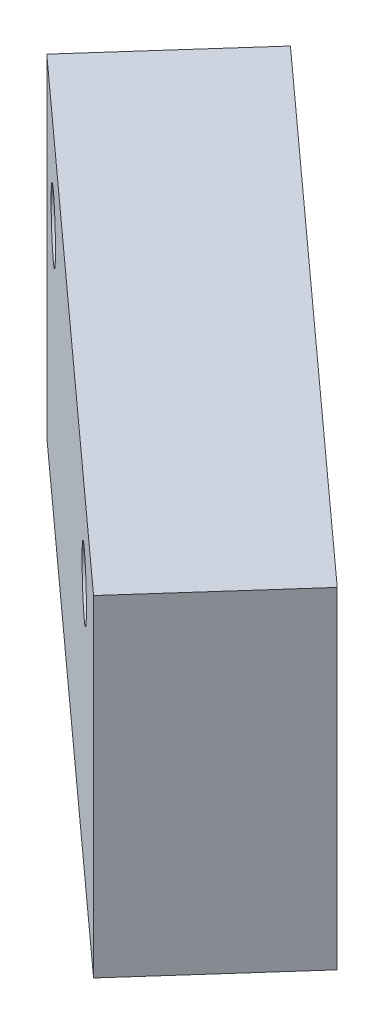
ISO-10303-21;
HEADER;
FILE_DESCRIPTION(('STEP AP214'),'2;1');
FILE_NAME('part.step','',(''),(''),'','','');
FILE_SCHEMA(('AUTOMOTIVE_DESIGN { 1 0 10303 214 1 1 1 1 }'));
ENDSEC;
DATA;
#1=APPLICATION_CONTEXT('core data for automotive mechanical design processes');
#2=APPLICATION_PROTOCOL_DEFINITION('international standard','automotive_design',2000,#1);
#3=PRODUCT_CONTEXT('',#1,'mechanical');
#4=PRODUCT('Part','Part','',(#3));
#5=PRODUCT_RELATED_PRODUCT_CATEGORY('part','',(#4));
#6=PRODUCT_DEFINITION_FORMATION('','',#4);
#7=PRODUCT_DEFINITION_CONTEXT('part definition',#1,'design');
#8=PRODUCT_DEFINITION('design','',#6,#7);
#9=PRODUCT_DEFINITION_SHAPE('','',#8);
#10=(LENGTH_UNIT() NAMED_UNIT(*) SI_UNIT(.MILLI.,.METRE.));
#11=(NAMED_UNIT(*) PLANE_ANGLE_UNIT() SI_UNIT($,.RADIAN.));
#12=(NAMED_UNIT(*) SI_UNIT($,.STERADIAN.) SOLID_ANGLE_UNIT());
#13=UNCERTAINTY_MEASURE_WITH_UNIT(LENGTH_MEASURE(1.E-05),#10,'distance_accuracy_value','');
#14=(GEOMETRIC_REPRESENTATION_CONTEXT(3) GLOBAL_UNCERTAINTY_ASSIGNED_CONTEXT((#13)) GLOBAL_UNIT_ASSIGNED_CONTEXT((#10,
#11,#12)) REPRESENTATION_CONTEXT('',''));
#15=CARTESIAN_POINT('',(0.,0.,0.));
#16=DIRECTION('',(0.,0.,1.));
#17=DIRECTION('',(1.,0.,0.));
#18=AXIS2_PLACEMENT_3D('',#15,#16,#17);
#19=CARTESIAN_POINT('',(0.180321334409129,0.,-0.199266915510276));
#20=DIRECTION('',(0.670979247329059,0.,-0.74147612884956));
#21=DIRECTION('',(-0.74147612884956,0.,-0.670979247329059));
#22=AXIS2_PLACEMENT_3D('',#19,#20,#21);
#23=PLANE('',#22);
#24=DIRECTION('',(0.,-1.,0.));
#25=VECTOR('',#24,1.);
#26=CARTESIAN_POINT('',(-17.7575242155149,27.,-16.4316466746096));
#27=LINE('',#26,#25);
#28=CARTESIAN_POINT('',(-17.7575242155149,27.,-16.4316466746096));
#29=VERTEX_POINT('',#28);
#30=CARTESIAN_POINT('',(-17.7575242155149,0.,-16.4316466746096));
#31=VERTEX_POINT('',#30);
#32=EDGE_CURVE('E289',#29,#31,#27,.T.);
#33=ORIENTED_EDGE('',*,*,#32,.F.);
#34=DIRECTION('',(0.74147612884956,0.,0.670979247329059));
#35=VECTOR('',#34,1.);
#36=CARTESIAN_POINT('',(0.180321334409129,27.,-0.199266915510276));
#37=LINE('',#36,#35);
#38=CARTESIAN_POINT('',(22.3728310041526,27.,19.8832588127975));
#39=VERTEX_POINT('',#38);
#40=EDGE_CURVE('E298',#29,#39,#37,.T.);
#41=ORIENTED_EDGE('',*,*,#40,.T.);
#42=DIRECTION('',(0.,1.,0.));
#43=VECTOR('',#42,1.);
#44=CARTESIAN_POINT('',(22.3728310041526,27.,19.8832588127975));
#45=LINE('',#44,#43);
#46=CARTESIAN_POINT('',(22.3728310041526,0.,19.8832588127975));
#47=VERTEX_POINT('',#46);
#48=EDGE_CURVE('E293',#47,#39,#45,.T.);
#49=ORIENTED_EDGE('',*,*,#48,.F.);
#50=DIRECTION('',(0.74147612884956,0.,0.670979247329059));
#51=VECTOR('',#50,1.);
#52=CARTESIAN_POINT('',(0.180321334409129,0.,-0.199266915510276));
#53=LINE('',#52,#51);
#54=CARTESIAN_POINT('',(19.241101723208,0.,17.0492830797865));
#55=VERTEX_POINT('',#54);
#56=EDGE_CURVE('E282',#55,#47,#53,.T.);
#57=ORIENTED_EDGE('',*,*,#56,.F.);
#58=DIRECTION('',(0.,-1.,0.));
#59=VECTOR('',#58,1.);
#60=CARTESIAN_POINT('',(19.241101723208,7.,17.0492830797865));
#61=LINE('',#60,#59);
#62=CARTESIAN_POINT('',(19.241101723208,7.,17.0492830797865));
#63=VERTEX_POINT('',#62);
#64=EDGE_CURVE('E313',#63,#55,#61,.T.);
#65=ORIENTED_EDGE('',*,*,#64,.F.);
#66=DIRECTION('',(-0.74147612884956,0.,-0.670979247329059));
#67=VECTOR('',#66,1.);
#68=CARTESIAN_POINT('',(0.180321334409129,7.,-0.199266915510276));
#69=LINE('',#68,#67);
#70=CARTESIAN_POINT('',(16.3901305800542,7.,14.4693720113638));
#71=VERTEX_POINT('',#70);
#72=EDGE_CURVE('E309',#63,#71,#69,.T.);
#73=ORIENTED_EDGE('',*,*,#72,.T.);
#74=DIRECTION('',(0.,-1.,0.));
#75=VECTOR('',#74,1.);
#76=CARTESIAN_POINT('',(16.3901305800542,7.,14.4693720113638));
#77=LINE('',#76,#75);
#78=CARTESIAN_POINT('',(16.3901305800542,0.,14.4693720113638));
#79=VERTEX_POINT('',#78);
#80=EDGE_CURVE('E330',#71,#79,#77,.T.);
#81=ORIENTED_EDGE('',*,*,#80,.T.);
#82=DIRECTION('',(0.74147612884956,0.,0.670979247329059));
#83=VECTOR('',#82,1.);
#84=CARTESIAN_POINT('',(0.180321334409129,0.,-0.199266915510276));
#85=LINE('',#84,#83);
#86=CARTESIAN_POINT('',(13.5040535540342,0.,11.8576928010605));
#87=VERTEX_POINT('',#86);
#88=EDGE_CURVE('E270',#87,#79,#85,.T.);
#89=ORIENTED_EDGE('',*,*,#88,.F.);
#90=DIRECTION('',(0.,-1.,0.));
#91=VECTOR('',#90,1.);
#92=CARTESIAN_POINT('',(13.5040535540342,7.,11.8576928010605));
#93=LINE('',#92,#91);
#94=CARTESIAN_POINT('',(13.5040535540342,7.,11.8576928010605));
#95=VERTEX_POINT('',#94);
#96=EDGE_CURVE('E326',#87,#95,#93,.F.);
#97=ORIENTED_EDGE('',*,*,#96,.T.);
#98=CARTESIAN_POINT('',(10.1268477535171,7.,8.80157957240913));
#99=VERTEX_POINT('',#98);
#100=EDGE_CURVE('E260',#95,#99,#69,.T.);
#101=ORIENTED_EDGE('',*,*,#100,.T.);
#102=DIRECTION('',(0.,-1.,0.));
#103=VECTOR('',#102,1.);
#104=CARTESIAN_POINT('',(10.1268477535171,22.,8.80157957240913));
#105=LINE('',#104,#103);
#106=CARTESIAN_POINT('',(10.1268477535171,22.,8.80157957240914));
#107=VERTEX_POINT('',#106);
#108=EDGE_CURVE('E317',#107,#99,#105,.T.);
#109=ORIENTED_EDGE('',*,*,#108,.F.);
#110=DIRECTION('',(-0.74147612884956,0.,-0.670979247329059));
#111=VECTOR('',#110,1.);
#112=CARTESIAN_POINT('',(0.180321334409129,22.,-0.199266915510276));
#113=LINE('',#112,#111);
#114=CARTESIAN_POINT('',(6.10878243947018,22.,5.16553744611543));
#115=VERTEX_POINT('',#114);
#116=EDGE_CURVE('E351',#107,#115,#113,.T.);
#117=ORIENTED_EDGE('',*,*,#116,.T.);
#118=DIRECTION('',(0.,1.,0.));
#119=VECTOR('',#118,1.);
#120=CARTESIAN_POINT('',(6.10878243947018,12.,5.16553744611543));
#121=LINE('',#120,#119);
#122=CARTESIAN_POINT('',(6.10878243947018,12.,5.16553744611543));
#123=VERTEX_POINT('',#122);
#124=EDGE_CURVE('E347',#123,#115,#121,.T.);
#125=ORIENTED_EDGE('',*,*,#124,.F.);
#126=DIRECTION('',(-0.74147612884956,0.,-0.670979247329059));
#127=VECTOR('',#126,1.);
#128=CARTESIAN_POINT('',(0.180321334409129,12.,-0.199266915510276));
#129=LINE('',#128,#127);
#130=CARTESIAN_POINT('',(5.2950846684095,12.,4.42920313036783));
#131=VERTEX_POINT('',#130);
#132=EDGE_CURVE('E352',#123,#131,#129,.T.);
#133=ORIENTED_EDGE('',*,*,#132,.T.);
#134=DIRECTION('',(0.,-1.,0.));
#135=VECTOR('',#134,1.);
#136=CARTESIAN_POINT('',(5.2950846684095,7.,4.42920313036783));
#137=LINE('',#136,#135);
#138=CARTESIAN_POINT('',(5.2950846684095,0.,4.42920313036783));
#139=VERTEX_POINT('',#138);
#140=EDGE_CURVE('E261',#131,#139,#137,.T.);
#141=ORIENTED_EDGE('',*,*,#140,.T.);
#142=DIRECTION('',(0.74147612884956,0.,0.670979247329059));
#143=VECTOR('',#142,1.);
#144=CARTESIAN_POINT('',(0.180321334409129,0.,-0.199266915510276));
#145=LINE('',#144,#143);
#146=CARTESIAN_POINT('',(-4.63515238000912,0.,-4.55690272159674));
#147=VERTEX_POINT('',#146);
#148=EDGE_CURVE('E45',#147,#139,#145,.T.);
#149=ORIENTED_EDGE('',*,*,#148,.F.);
#150=DIRECTION('',(0.,-1.,0.));
#151=VECTOR('',#150,1.);
#152=CARTESIAN_POINT('',(-4.63515238000912,7.,-4.55690272159674));
#153=LINE('',#152,#151);
#154=CARTESIAN_POINT('',(-4.63515238000912,12.,-4.55690272159674));
#155=VERTEX_POINT('',#154);
#156=EDGE_CURVE('E253',#147,#155,#153,.F.);
#157=ORIENTED_EDGE('',*,*,#156,.T.);
#158=DIRECTION('',(-0.74147612884956,0.,-0.670979247329059));
#159=VECTOR('',#158,1.);
#160=CARTESIAN_POINT('',(0.180321334409129,12.,-0.199266915510276));
#161=LINE('',#160,#159);
#162=CARTESIAN_POINT('',(-5.74813977065192,12.,-5.56407127713598));
#163=VERTEX_POINT('',#162);
#164=EDGE_CURVE('E355',#155,#163,#161,.T.);
#165=ORIENTED_EDGE('',*,*,#164,.T.);
#166=DIRECTION('',(0.,1.,0.));
#167=VECTOR('',#166,1.);
#168=CARTESIAN_POINT('',(-5.74813977065192,12.,-5.56407127713598));
#169=LINE('',#168,#167);
#170=CARTESIAN_POINT('',(-5.74813977065192,22.,-5.56407127713598));
#171=VERTEX_POINT('',#170);
#172=EDGE_CURVE('E358',#171,#163,#169,.F.);
#173=ORIENTED_EDGE('',*,*,#172,.F.);
#174=CARTESIAN_POINT('',(-6.45742945742896,22.,-6.20592425345544));
#175=VERTEX_POINT('',#174);
#176=EDGE_CURVE('E343',#171,#175,#113,.T.);
#177=ORIENTED_EDGE('',*,*,#176,.T.);
#178=DIRECTION('',(0.,-1.,0.));
#179=VECTOR('',#178,1.);
#180=CARTESIAN_POINT('',(-6.45742945742896,22.,-6.20592425345544));
#181=LINE('',#180,#179);
#182=CARTESIAN_POINT('',(-6.45742945742896,7.,-6.20592425345544));
#183=VERTEX_POINT('',#182);
#184=EDGE_CURVE('E339',#175,#183,#181,.T.);
#185=ORIENTED_EDGE('',*,*,#184,.T.);
#186=DIRECTION('',(-0.74147612884956,0.,-0.670979247329059));
#187=VECTOR('',#186,1.);
#188=CARTESIAN_POINT('',(0.180321334409129,7.,-0.199266915510276));
#189=LINE('',#188,#187);
#190=CARTESIAN_POINT('',(-8.11647189445451,7.,-7.7072309069947));
#191=VERTEX_POINT('',#190);
#192=EDGE_CURVE('E338',#183,#191,#189,.T.);
#193=ORIENTED_EDGE('',*,*,#192,.T.);
#194=DIRECTION('',(0.,-1.,0.));
#195=VECTOR('',#194,1.);
#196=CARTESIAN_POINT('',(-8.11647189445451,7.,-7.7072309069947));
#197=LINE('',#196,#195);
#198=CARTESIAN_POINT('',(-8.11647189445451,0.,-7.7072309069947));
#199=VERTEX_POINT('',#198);
#200=EDGE_CURVE('E322',#191,#199,#197,.T.);
#201=ORIENTED_EDGE('',*,*,#200,.T.);
#202=DIRECTION('',(0.74147612884956,0.,0.670979247329059));
#203=VECTOR('',#202,1.);
#204=CARTESIAN_POINT('',(0.180321334409129,0.,-0.199266915510276));
#205=LINE('',#204,#203);
#206=CARTESIAN_POINT('',(-11.0968622551529,0.,-10.4042564795792));
#207=VERTEX_POINT('',#206);
#208=EDGE_CURVE('E277',#207,#199,#205,.T.);
#209=ORIENTED_EDGE('',*,*,#208,.F.);
#210=DIRECTION('',(0.,-1.,0.));
#211=VECTOR('',#210,1.);
#212=CARTESIAN_POINT('',(-11.0968622551529,7.,-10.4042564795792));
#213=LINE('',#212,#211);
#214=CARTESIAN_POINT('',(-11.0968622551529,7.,-10.4042564795792));
#215=VERTEX_POINT('',#214);
#216=EDGE_CURVE('E318',#207,#215,#213,.F.);
#217=ORIENTED_EDGE('',*,*,#216,.T.);
#218=CARTESIAN_POINT('',(-13.9430557088245,7.,-12.9798441040392));
#219=VERTEX_POINT('',#218);
#220=EDGE_CURVE('E334',#215,#219,#189,.T.);
#221=ORIENTED_EDGE('',*,*,#220,.T.);
#222=DIRECTION('',(0.,-1.,0.));
#223=VECTOR('',#222,1.);
#224=CARTESIAN_POINT('',(-13.9430557088245,7.,-12.9798441040392));
#225=LINE('',#224,#223);
#226=CARTESIAN_POINT('',(-13.9430557088245,0.,-12.9798441040392));
#227=VERTEX_POINT('',#226);
#228=EDGE_CURVE('E297',#227,#219,#225,.F.);
#229=ORIENTED_EDGE('',*,*,#228,.F.);
#230=EDGE_CURVE('E285',#31,#227,#53,.T.);
#231=ORIENTED_EDGE('',*,*,#230,.F.);
#232=EDGE_LOOP('',(#33,#41,#49,#57,#65,#73,#81,#89,#97,#101,#109,#117,#125,#133,#141,#149,#157,
#165,#173,#177,#185,#193,#201,#209,#217,#221,#229,#231));
#233=FACE_BOUND('',#232,.T.);
#234=CARTESIAN_POINT('',(-12.0858954641083,20.2282122973391,-11.299255970875));
#235=DIRECTION('',(0.670979247329059,0.,-0.74147612884956));
#236=DIRECTION('',(-0.74147612884956,0.,-0.670979247329059));
#237=AXIS2_PLACEMENT_3D('',#234,#235,#236);
#238=CIRCLE('',#237,2.5);
#239=CARTESIAN_POINT('',(-13.9395857862322,20.2282122973391,-12.9767040891976));
#240=VERTEX_POINT('',#239);
#241=EDGE_CURVE('E302',#240,#240,#238,.F.);
#242=ORIENTED_EDGE('',*,*,#241,.T.);
#243=EDGE_LOOP('',(#242));
#244=FACE_BOUND('',#243,.T.);
#245=CARTESIAN_POINT('',(14.4574317839117,20.2282122973391,12.7204272603554));
#246=DIRECTION('',(0.670979247329059,0.,-0.74147612884956));
#247=DIRECTION('',(-0.74147612884956,0.,-0.670979247329059));
#248=AXIS2_PLACEMENT_3D('',#245,#246,#247);
#249=CIRCLE('',#248,2.5);
#250=CARTESIAN_POINT('',(12.6037414617879,20.2282122973391,11.0429791420328));
#251=VERTEX_POINT('',#250);
#252=EDGE_CURVE('E304',#251,#251,#249,.F.);
#253=ORIENTED_EDGE('',*,*,#252,.T.);
#254=EDGE_LOOP('',(#253));
#255=FACE_BOUND('',#254,.T.);
#256=ADVANCED_FACE('F42',(#233,#244,#255),#23,.T.);
#257=CARTESIAN_POINT('',(-2.25,12.,0.));
#258=DIRECTION('',(0.,1.,0.));
#259=DIRECTION('',(0.,0.,1.));
#260=AXIS2_PLACEMENT_3D('',#257,#258,#259);
#261=PLANE('',#260);
#262=CARTESIAN_POINT('',(-4.5,12.,0.));
#263=DIRECTION('',(0.,1.,0.));
#264=DIRECTION('',(0.,0.,1.));
#265=AXIS2_PLACEMENT_3D('',#262,#263,#264);
#266=CIRCLE('',#265,4.5);
#267=CARTESIAN_POINT('',(-7.11111111111111,12.,-3.66498277832681));
#268=VERTEX_POINT('',#267);
#269=CARTESIAN_POINT('',(-7.11111111111111,12.,3.66498277832681));
#270=VERTEX_POINT('',#269);
#271=EDGE_CURVE('E269',#268,#270,#266,.T.);
#272=ORIENTED_EDGE('',*,*,#271,.T.);
#273=CARTESIAN_POINT('',(0.,12.,0.));
#274=DIRECTION('',(0.,-1.,0.));
#275=DIRECTION('',(0.,0.,1.));
#276=AXIS2_PLACEMENT_3D('',#273,#274,#275);
#277=CIRCLE('',#276,8.);
#278=EDGE_CURVE('E274',#270,#268,#277,.T.);
#279=ORIENTED_EDGE('',*,*,#278,.T.);
#280=EDGE_LOOP('',(#272,#279));
#281=FACE_BOUND('',#280,.T.);
#282=ADVANCED_FACE('F627',(#281),#261,.T.);
#283=CARTESIAN_POINT('',(0.,12.,0.));
#284=DIRECTION('',(0.,1.,0.));
#285=DIRECTION('',(0.,0.,1.));
#286=AXIS2_PLACEMENT_3D('',#283,#284,#285);
#287=CYLINDRICAL_SURFACE('',#286,8.);
#288=CARTESIAN_POINT('',(0.,22.,0.));
#289=DIRECTION('',(0.,1.,0.));
#290=DIRECTION('',(0.,0.,1.));
#291=AXIS2_PLACEMENT_3D('',#288,#289,#290);
#292=CIRCLE('',#291,8.);
#293=EDGE_CURVE('E396',#171,#115,#292,.T.);
#294=ORIENTED_EDGE('',*,*,#293,.F.);
#295=ORIENTED_EDGE('',*,*,#172,.T.);
#296=CARTESIAN_POINT('',(0.,12.,0.));
#297=DIRECTION('',(0.,1.,0.));
#298=DIRECTION('',(0.,0.,1.));
#299=AXIS2_PLACEMENT_3D('',#296,#297,#298);
#300=CIRCLE('',#299,8.);
#301=EDGE_CURVE('E443',#163,#268,#300,.T.);
#302=ORIENTED_EDGE('',*,*,#301,.T.);
#303=ORIENTED_EDGE('',*,*,#278,.F.);
#304=EDGE_CURVE('E440',#270,#123,#300,.T.);
#305=ORIENTED_EDGE('',*,*,#304,.T.);
#306=ORIENTED_EDGE('',*,*,#124,.T.);
#307=EDGE_LOOP('',(#294,#295,#302,#303,#305,#306));
#308=FACE_BOUND('',#307,.T.);
#309=ADVANCED_FACE('F629',(#308),#287,.T.);
#310=CARTESIAN_POINT('',(0.,22.,0.));
#311=DIRECTION('',(0.,1.,0.));
#312=DIRECTION('',(0.,0.,1.));
#313=AXIS2_PLACEMENT_3D('',#310,#311,#312);
#314=PLANE('',#313);
#315=ORIENTED_EDGE('',*,*,#116,.F.);
#316=CARTESIAN_POINT('',(2.81741341811794,22.,1.18386679753758));
#317=DIRECTION('',(0.,1.,0.));
#318=DIRECTION('',(0.,0.,1.));
#319=AXIS2_PLACEMENT_3D('',#316,#317,#318);
#320=CIRCLE('',#319,10.5573376484771);
#321=CARTESIAN_POINT('',(-1.4542464793394,22.,10.8384149456597));
#322=VERTEX_POINT('',#321);
#323=EDGE_CURVE('E417',#322,#107,#320,.T.);
#324=ORIENTED_EDGE('',*,*,#323,.F.);
#325=DIRECTION('',(0.914487010796204,0.,0.40461525809715));
#326=VECTOR('',#325,1.);
#327=CARTESIAN_POINT('',(-4.24846021002008,22.,9.60211361336014));
#328=LINE('',#327,#326);
#329=CARTESIAN_POINT('',(-4.24846021002008,22.,9.60211361336014));
#330=VERTEX_POINT('',#329);
#331=EDGE_CURVE('E421',#330,#322,#328,.T.);
#332=ORIENTED_EDGE('',*,*,#331,.F.);
#333=CARTESIAN_POINT('',(0.,22.,0.));
#334=DIRECTION('',(0.,1.,0.));
#335=DIRECTION('',(0.,0.,1.));
#336=AXIS2_PLACEMENT_3D('',#333,#334,#335);
#337=CIRCLE('',#336,10.5);
#338=CARTESIAN_POINT('',(-4.85530679933666,22.,9.30999440839334));
#339=VERTEX_POINT('',#338);
#340=EDGE_CURVE('E480',#339,#330,#337,.T.);
#341=ORIENTED_EDGE('',*,*,#340,.F.);
#342=CARTESIAN_POINT('',(-46.4722222222223,22.,89.1099464803362));
#343=DIRECTION('',(0.,1.,0.));
#344=DIRECTION('',(0.,0.,1.));
#345=AXIS2_PLACEMENT_3D('',#342,#343,#344);
#346=CIRCLE('',#345,90.);
#347=CARTESIAN_POINT('',(-8.12196841511563,22.,7.68969081302393));
#348=VERTEX_POINT('',#347);
#349=EDGE_CURVE('E477',#348,#339,#346,.F.);
#350=ORIENTED_EDGE('',*,*,#349,.F.);
#351=CARTESIAN_POINT('',(-4.5,22.,0.));
#352=DIRECTION('',(0.,1.,0.));
#353=DIRECTION('',(0.,0.,1.));
#354=AXIS2_PLACEMENT_3D('',#351,#352,#353);
#355=CIRCLE('',#354,8.5);
#356=CARTESIAN_POINT('',(-12.3085207840849,22.,3.35812494772206));
#357=VERTEX_POINT('',#356);
#358=EDGE_CURVE('E473',#357,#348,#355,.T.);
#359=ORIENTED_EDGE('',*,*,#358,.F.);
#360=DIRECTION('',(0.252032006088508,0.,0.967718899219707));
#361=VECTOR('',#360,1.);
#362=CARTESIAN_POINT('',(-12.3457156152864,22.,3.21530919322515));
#363=LINE('',#362,#361);
#364=CARTESIAN_POINT('',(-13.4468800977769,22.,-1.01279539314789));
#365=VERTEX_POINT('',#364);
#366=EDGE_CURVE('E470',#365,#357,#363,.T.);
#367=ORIENTED_EDGE('',*,*,#366,.F.);
#368=CARTESIAN_POINT('',(-11.5114422993375,22.,-1.51685940532491));
#369=DIRECTION('',(0.,1.,0.));
#370=DIRECTION('',(0.,0.,1.));
#371=AXIS2_PLACEMENT_3D('',#368,#369,#370);
#372=CIRCLE('',#371,2.);
#373=CARTESIAN_POINT('',(-11.2323330034858,22.,-3.49728814702938));
#374=VERTEX_POINT('',#373);
#375=EDGE_CURVE('E425',#365,#374,#372,.F.);
#376=ORIENTED_EDGE('',*,*,#375,.T.);
#377=CARTESIAN_POINT('',(-10.6043370878193,22.,-7.95325281586443));
#378=DIRECTION('',(0.,1.,0.));
#379=DIRECTION('',(0.,0.,1.));
#380=AXIS2_PLACEMENT_3D('',#377,#378,#379);
#381=CIRCLE('',#380,4.5);
#382=EDGE_CURVE('E422',#374,#175,#381,.T.);
#383=ORIENTED_EDGE('',*,*,#382,.T.);
#384=ORIENTED_EDGE('',*,*,#176,.F.);
#385=ORIENTED_EDGE('',*,*,#293,.T.);
#386=EDGE_LOOP('',(#315,#324,#332,#341,#350,#359,#367,#376,#383,#384,#385));
#387=FACE_BOUND('',#386,.T.);
#388=ADVANCED_FACE('F580',(#387),#314,.F.);
#389=CARTESIAN_POINT('',(-12.3457156152864,22.,3.21530919322515));
#390=DIRECTION('',(0.967718899219707,0.,-0.252032006088508));
#391=DIRECTION('',(-0.252032006088508,0.,-0.967718899219707));
#392=AXIS2_PLACEMENT_3D('',#389,#390,#391);
#393=PLANE('',#392);
#394=DIRECTION('',(0.252032006088508,0.,0.967718899219707));
#395=VECTOR('',#394,1.);
#396=CARTESIAN_POINT('',(-12.3457156152864,7.,3.21530919322515));
#397=LINE('',#396,#395);
#398=CARTESIAN_POINT('',(-13.4468800977769,7.,-1.01279539314789));
#399=VERTEX_POINT('',#398);
#400=CARTESIAN_POINT('',(-12.3085207840849,7.,3.35812494772206));
#401=VERTEX_POINT('',#400);
#402=EDGE_CURVE('E429',#399,#401,#397,.T.);
#403=ORIENTED_EDGE('',*,*,#402,.F.);
#404=DIRECTION('',(0.,-1.,0.));
#405=VECTOR('',#404,1.);
#406=CARTESIAN_POINT('',(-13.4468800977769,22.,-1.01279539314789));
#407=LINE('',#406,#405);
#408=EDGE_CURVE('E498',#365,#399,#407,.T.);
#409=ORIENTED_EDGE('',*,*,#408,.F.);
#410=ORIENTED_EDGE('',*,*,#366,.T.);
#411=DIRECTION('',(0.,-1.,0.));
#412=VECTOR('',#411,1.);
#413=CARTESIAN_POINT('',(-12.3085207840849,22.,3.35812494772206));
#414=LINE('',#413,#412);
#415=EDGE_CURVE('E494',#357,#401,#414,.T.);
#416=ORIENTED_EDGE('',*,*,#415,.T.);
#417=EDGE_LOOP('',(#403,#409,#410,#416));
#418=FACE_BOUND('',#417,.T.);
#419=ADVANCED_FACE('F639',(#418),#393,.T.);
#420=CARTESIAN_POINT('',(-11.5114422993375,22.,-1.51685940532491));
#421=DIRECTION('',(0.,-1.,0.));
#422=DIRECTION('',(0.,0.,-1.));
#423=AXIS2_PLACEMENT_3D('',#420,#421,#422);
#424=CYLINDRICAL_SURFACE('',#423,2.);
#425=CARTESIAN_POINT('',(-11.5114422993375,7.,-1.51685940532491));
#426=DIRECTION('',(0.,1.,0.));
#427=DIRECTION('',(0.,0.,1.));
#428=AXIS2_PLACEMENT_3D('',#425,#426,#427);
#429=CIRCLE('',#428,2.);
#430=CARTESIAN_POINT('',(-11.2323330034858,7.,-3.49728814702938));
#431=VERTEX_POINT('',#430);
#432=EDGE_CURVE('E433',#399,#431,#429,.F.);
#433=ORIENTED_EDGE('',*,*,#432,.T.);
#434=DIRECTION('',(0.,-1.,0.));
#435=VECTOR('',#434,1.);
#436=CARTESIAN_POINT('',(-11.2323330034858,22.,-3.49728814702938));
#437=LINE('',#436,#435);
#438=EDGE_CURVE('E416',#374,#431,#437,.T.);
#439=ORIENTED_EDGE('',*,*,#438,.F.);
#440=ORIENTED_EDGE('',*,*,#375,.F.);
#441=ORIENTED_EDGE('',*,*,#408,.T.);
#442=EDGE_LOOP('',(#433,#439,#440,#441));
#443=FACE_BOUND('',#442,.T.);
#444=ADVANCED_FACE('F653',(#443),#424,.F.);
#445=CARTESIAN_POINT('',(-10.6043370878193,22.,-7.95325281586443));
#446=DIRECTION('',(0.,-1.,0.));
#447=DIRECTION('',(0.,0.,-1.));
#448=AXIS2_PLACEMENT_3D('',#445,#446,#447);
#449=CYLINDRICAL_SURFACE('',#448,4.5);
#450=ORIENTED_EDGE('',*,*,#184,.F.);
#451=ORIENTED_EDGE('',*,*,#382,.F.);
#452=ORIENTED_EDGE('',*,*,#438,.T.);
#453=CARTESIAN_POINT('',(-10.6043370878193,7.,-7.95325281586443));
#454=DIRECTION('',(0.,1.,0.));
#455=DIRECTION('',(0.,0.,1.));
#456=AXIS2_PLACEMENT_3D('',#453,#454,#455);
#457=CIRCLE('',#456,4.5);
#458=EDGE_CURVE('E430',#431,#183,#457,.T.);
#459=ORIENTED_EDGE('',*,*,#458,.T.);
#460=EDGE_LOOP('',(#450,#451,#452,#459));
#461=FACE_BOUND('',#460,.T.);
#462=ADVANCED_FACE('F585',(#461),#449,.T.);
#463=CARTESIAN_POINT('',(0.,7.,0.));
#464=DIRECTION('',(0.,1.,0.));
#465=DIRECTION('',(0.,0.,1.));
#466=AXIS2_PLACEMENT_3D('',#463,#464,#465);
#467=PLANE('',#466);
#468=ORIENTED_EDGE('',*,*,#192,.F.);
#469=ORIENTED_EDGE('',*,*,#458,.F.);
#470=ORIENTED_EDGE('',*,*,#432,.F.);
#471=ORIENTED_EDGE('',*,*,#402,.T.);
#472=DIRECTION('',(0.39507352326142,0.,0.918649504009994));
#473=VECTOR('',#472,1.);
#474=CARTESIAN_POINT('',(-11.6061468845651,7.,4.99132838058419));
#475=LINE('',#474,#473);
#476=CARTESIAN_POINT('',(-16.1478111942284,7.,-5.56923166659305));
#477=VERTEX_POINT('',#476);
#478=EDGE_CURVE('E409',#477,#401,#475,.T.);
#479=ORIENTED_EDGE('',*,*,#478,.F.);
#480=CARTESIAN_POINT('',(-10.6043370878193,7.,-7.95325281586443));
#481=DIRECTION('',(0.,1.,0.));
#482=DIRECTION('',(0.,0.,1.));
#483=AXIS2_PLACEMENT_3D('',#480,#481,#482);
#484=CIRCLE('',#483,6.03437337331733);
#485=EDGE_CURVE('E406',#219,#477,#484,.T.);
#486=ORIENTED_EDGE('',*,*,#485,.F.);
#487=ORIENTED_EDGE('',*,*,#220,.F.);
#488=CARTESIAN_POINT('',(-10.6043370878193,7.,-7.95325281586443));
#489=DIRECTION('',(0.,1.,0.));
#490=DIRECTION('',(0.,0.,1.));
#491=AXIS2_PLACEMENT_3D('',#488,#489,#490);
#492=CIRCLE('',#491,2.5);
#493=EDGE_CURVE('E410',#215,#191,#492,.T.);
#494=ORIENTED_EDGE('',*,*,#493,.T.);
#495=EDGE_LOOP('',(#468,#469,#470,#471,#479,#486,#487,#494));
#496=FACE_BOUND('',#495,.T.);
#497=ADVANCED_FACE('F591',(#496),#467,.F.);
#498=CARTESIAN_POINT('',(16.0000000000001,7.,12.));
#499=DIRECTION('',(0.,-1.,0.));
#500=DIRECTION('',(0.,0.,-1.));
#501=AXIS2_PLACEMENT_3D('',#498,#499,#500);
#502=CYLINDRICAL_SURFACE('',#501,2.5);
#503=ORIENTED_EDGE('',*,*,#80,.F.);
#504=CARTESIAN_POINT('',(16.0000000000001,7.,12.));
#505=DIRECTION('',(0.,1.,0.));
#506=DIRECTION('',(0.,0.,1.));
#507=AXIS2_PLACEMENT_3D('',#504,#505,#506);
#508=CIRCLE('',#507,2.5);
#509=EDGE_CURVE('E413',#95,#71,#508,.T.);
#510=ORIENTED_EDGE('',*,*,#509,.F.);
#511=ORIENTED_EDGE('',*,*,#96,.F.);
#512=CARTESIAN_POINT('',(16.0000000000001,0.,12.));
#513=DIRECTION('',(0.,1.,0.));
#514=DIRECTION('',(0.,0.,1.));
#515=AXIS2_PLACEMENT_3D('',#512,#513,#514);
#516=CIRCLE('',#515,2.5);
#517=EDGE_CURVE('E389',#87,#79,#516,.T.);
#518=ORIENTED_EDGE('',*,*,#517,.T.);
#519=EDGE_LOOP('',(#503,#510,#511,#518));
#520=FACE_BOUND('',#519,.T.);
#521=ADVANCED_FACE('F608',(#520),#502,.T.);
#522=CARTESIAN_POINT('',(0.,0.,0.));
#523=DIRECTION('',(0.,-1.,0.));
#524=DIRECTION('',(0.,0.,-1.));
#525=AXIS2_PLACEMENT_3D('',#522,#523,#524);
#526=PLANE('',#525);
#527=ORIENTED_EDGE('',*,*,#517,.F.);
#528=ORIENTED_EDGE('',*,*,#88,.T.);
#529=EDGE_LOOP('',(#527,#528));
#530=FACE_BOUND('',#529,.T.);
#531=ADVANCED_FACE('F609',(#530),#526,.T.);
#532=CARTESIAN_POINT('',(2.81741341811794,22.,1.18386679753758));
#533=DIRECTION('',(0.,-1.,0.));
#534=DIRECTION('',(0.,0.,-1.));
#535=AXIS2_PLACEMENT_3D('',#532,#533,#534);
#536=CYLINDRICAL_SURFACE('',#535,10.5573376484771);
#537=ORIENTED_EDGE('',*,*,#323,.T.);
#538=ORIENTED_EDGE('',*,*,#108,.T.);
#539=CARTESIAN_POINT('',(2.81741341811794,7.,1.18386679753758));
#540=DIRECTION('',(0.,1.,0.));
#541=DIRECTION('',(0.,0.,1.));
#542=AXIS2_PLACEMENT_3D('',#539,#540,#541);
#543=CIRCLE('',#542,10.5573376484771);
#544=CARTESIAN_POINT('',(-1.4542464793394,7.,10.8384149456597));
#545=VERTEX_POINT('',#544);
#546=EDGE_CURVE('E426',#545,#99,#543,.T.);
#547=ORIENTED_EDGE('',*,*,#546,.F.);
#548=DIRECTION('',(0.,-1.,0.));
#549=VECTOR('',#548,1.);
#550=CARTESIAN_POINT('',(-1.4542464793394,22.,10.8384149456597));
#551=LINE('',#550,#549);
#552=EDGE_CURVE('E420',#322,#545,#551,.T.);
#553=ORIENTED_EDGE('',*,*,#552,.F.);
#554=EDGE_LOOP('',(#537,#538,#547,#553));
#555=FACE_BOUND('',#554,.T.);
#556=ADVANCED_FACE('F611',(#555),#536,.F.);
#557=CARTESIAN_POINT('',(0.,27.,0.));
#558=DIRECTION('',(0.,-1.,0.));
#559=DIRECTION('',(0.,0.,-1.));
#560=AXIS2_PLACEMENT_3D('',#557,#558,#559);
#561=PLANE('',#560);
#562=ORIENTED_EDGE('',*,*,#40,.F.);
#563=DIRECTION('',(0.665087760425188,0.,-0.746765204687931));
#564=VECTOR('',#563,1.);
#565=CARTESIAN_POINT('',(-27.1139959489316,27.,-5.92613455287848));
#566=LINE('',#565,#564);
#567=CARTESIAN_POINT('',(-27.1139959489316,27.,-5.92613455287848));
#568=VERTEX_POINT('',#567);
#569=EDGE_CURVE('E371',#568,#29,#566,.T.);
#570=ORIENTED_EDGE('',*,*,#569,.F.);
#571=DIRECTION('',(-0.74147612884956,0.,-0.670979247329059));
#572=VECTOR('',#571,1.);
#573=CARTESIAN_POINT('',(13.0163592707359,27.,30.3887709345286));
#574=LINE('',#573,#572);
#575=CARTESIAN_POINT('',(13.0163592707359,27.,30.3887709345286));
#576=VERTEX_POINT('',#575);
#577=EDGE_CURVE('E377',#576,#568,#574,.T.);
#578=ORIENTED_EDGE('',*,*,#577,.F.);
#579=DIRECTION('',(-0.665087760425188,0.,0.746765204687931));
#580=VECTOR('',#579,1.);
#581=CARTESIAN_POINT('',(31.7293027375694,27.,9.37774669106641));
#582=LINE('',#581,#580);
#583=EDGE_CURVE('E374',#39,#576,#582,.T.);
#584=ORIENTED_EDGE('',*,*,#583,.F.);
#585=EDGE_LOOP('',(#562,#570,#578,#584));
#586=FACE_BOUND('',#585,.T.);
#587=ADVANCED_FACE('F617',(#586),#561,.F.);
#588=CARTESIAN_POINT('',(13.0163592707359,27.,30.3887709345286));
#589=DIRECTION('',(-0.670979247329059,0.,0.74147612884956));
#590=DIRECTION('',(0.74147612884956,0.,0.670979247329059));
#591=AXIS2_PLACEMENT_3D('',#588,#589,#590);
#592=PLANE('',#591);
#593=CARTESIAN_POINT('',(-21.524952939005,20.2282122973391,-0.868477635576405));
#594=DIRECTION('',(-0.670979247329059,0.,0.74147612884956));
#595=DIRECTION('',(0.74147612884956,0.,0.670979247329059));
#596=AXIS2_PLACEMENT_3D('',#593,#594,#595);
#597=CIRCLE('',#596,2.5);
#598=CARTESIAN_POINT('',(-19.6712626168811,20.2282122973391,0.808970482746242));
#599=VERTEX_POINT('',#598);
#600=EDGE_CURVE('E52',#599,#599,#597,.T.);
#601=ORIENTED_EDGE('',*,*,#600,.F.);
#602=EDGE_LOOP('',(#601));
#603=FACE_BOUND('',#602,.T.);
#604=CARTESIAN_POINT('',(5.0183743090151,20.2282122973391,23.151205595654));
#605=DIRECTION('',(-0.670979247329059,0.,0.74147612884956));
#606=DIRECTION('',(0.74147612884956,0.,0.670979247329059));
#607=AXIS2_PLACEMENT_3D('',#604,#605,#606);
#608=CIRCLE('',#607,2.5);
#609=CARTESIAN_POINT('',(6.872064631139,20.2282122973391,24.8286537139766));
#610=VERTEX_POINT('',#609);
#611=EDGE_CURVE('E12',#610,#610,#608,.T.);
#612=ORIENTED_EDGE('',*,*,#611,.F.);
#613=EDGE_LOOP('',(#612));
#614=FACE_BOUND('',#613,.T.);
#615=DIRECTION('',(-0.74147612884956,0.,-0.670979247329059));
#616=VECTOR('',#615,1.);
#617=CARTESIAN_POINT('',(13.0163592707359,0.,30.3887709345286));
#618=LINE('',#617,#616);
#619=CARTESIAN_POINT('',(13.0163592707359,0.,30.3887709345286));
#620=VERTEX_POINT('',#619);
#621=CARTESIAN_POINT('',(-27.1139959489316,0.,-5.92613455287848));
#622=VERTEX_POINT('',#621);
#623=EDGE_CURVE('E370',#620,#622,#618,.T.);
#624=ORIENTED_EDGE('',*,*,#623,.F.);
#625=DIRECTION('',(0.,-1.,0.));
#626=VECTOR('',#625,1.);
#627=CARTESIAN_POINT('',(13.0163592707359,27.,30.3887709345286));
#628=LINE('',#627,#626);
#629=EDGE_CURVE('E456',#576,#620,#628,.T.);
#630=ORIENTED_EDGE('',*,*,#629,.F.);
#631=ORIENTED_EDGE('',*,*,#577,.T.);
#632=DIRECTION('',(0.,-1.,0.));
#633=VECTOR('',#632,1.);
#634=CARTESIAN_POINT('',(-27.1139959489316,27.,-5.92613455287848));
#635=LINE('',#634,#633);
#636=EDGE_CURVE('E72',#568,#622,#635,.T.);
#637=ORIENTED_EDGE('',*,*,#636,.T.);
#638=EDGE_LOOP('',(#624,#630,#631,#637));
#639=FACE_BOUND('',#638,.T.);
#640=ADVANCED_FACE('F641',(#603,#614,#639),#592,.T.);
#641=CARTESIAN_POINT('',(31.7293027375694,27.,9.37774669106641));
#642=DIRECTION('',(0.746765204687931,0.,0.665087760425189));
#643=DIRECTION('',(0.665087760425189,0.,-0.746765204687931));
#644=AXIS2_PLACEMENT_3D('',#641,#642,#643);
#645=PLANE('',#644);
#646=DIRECTION('',(-0.665087760425188,0.,0.746765204687931));
#647=VECTOR('',#646,1.);
#648=CARTESIAN_POINT('',(31.7293027375694,0.,9.37774669106641));
#649=LINE('',#648,#647);
#650=EDGE_CURVE('E61',#47,#620,#649,.T.);
#651=ORIENTED_EDGE('',*,*,#650,.F.);
#652=ORIENTED_EDGE('',*,*,#48,.T.);
#653=ORIENTED_EDGE('',*,*,#583,.T.);
#654=ORIENTED_EDGE('',*,*,#629,.T.);
#655=EDGE_LOOP('',(#651,#652,#653,#654));
#656=FACE_BOUND('',#655,.T.);
#657=ADVANCED_FACE('F643',(#656),#645,.T.);
#658=CARTESIAN_POINT('',(16.0000000000001,7.,12.));
#659=DIRECTION('',(0.,-1.,0.));
#660=DIRECTION('',(0.,0.,-1.));
#661=AXIS2_PLACEMENT_3D('',#658,#659,#660);
#662=CYLINDRICAL_SURFACE('',#661,6.);
#663=CARTESIAN_POINT('',(16.0000000000001,7.,12.));
#664=DIRECTION('',(0.,1.,0.));
#665=DIRECTION('',(0.,0.,1.));
#666=AXIS2_PLACEMENT_3D('',#663,#664,#665);
#667=CIRCLE('',#666,6.);
#668=CARTESIAN_POINT('',(13.5723084514172,7.,17.4869220647772));
#669=VERTEX_POINT('',#668);
#670=EDGE_CURVE('E401',#669,#63,#667,.T.);
#671=ORIENTED_EDGE('',*,*,#670,.T.);
#672=ORIENTED_EDGE('',*,*,#64,.T.);
#673=CARTESIAN_POINT('',(16.0000000000001,0.,12.));
#674=DIRECTION('',(0.,1.,0.));
#675=DIRECTION('',(0.,0.,1.));
#676=AXIS2_PLACEMENT_3D('',#673,#674,#675);
#677=CIRCLE('',#676,6.);
#678=CARTESIAN_POINT('',(13.5723084514172,0.,17.4869220647772));
#679=VERTEX_POINT('',#678);
#680=EDGE_CURVE('E382',#679,#55,#677,.T.);
#681=ORIENTED_EDGE('',*,*,#680,.F.);
#682=DIRECTION('',(0.,-1.,0.));
#683=VECTOR('',#682,1.);
#684=CARTESIAN_POINT('',(13.5723084514172,7.,17.4869220647772));
#685=LINE('',#684,#683);
#686=EDGE_CURVE('E527',#669,#679,#685,.T.);
#687=ORIENTED_EDGE('',*,*,#686,.F.);
#688=EDGE_LOOP('',(#671,#672,#681,#687));
#689=FACE_BOUND('',#688,.T.);
#690=ADVANCED_FACE('F659',(#689),#662,.F.);
#691=CARTESIAN_POINT('',(-4.24846021002008,7.,9.60211361336014));
#692=DIRECTION('',(0.40461525809715,0.,-0.914487010796204));
#693=DIRECTION('',(-0.914487010796204,0.,-0.40461525809715));
#694=AXIS2_PLACEMENT_3D('',#691,#692,#693);
#695=PLANE('',#694);
#696=DIRECTION('',(0.914487010796204,0.,0.40461525809715));
#697=VECTOR('',#696,1.);
#698=CARTESIAN_POINT('',(-4.24846021002008,0.,9.60211361336014));
#699=LINE('',#698,#697);
#700=CARTESIAN_POINT('',(-4.24846021002008,0.,9.60211361336014));
#701=VERTEX_POINT('',#700);
#702=EDGE_CURVE('E384',#701,#679,#699,.T.);
#703=ORIENTED_EDGE('',*,*,#702,.F.);
#704=DIRECTION('',(0.,-1.,0.));
#705=VECTOR('',#704,1.);
#706=CARTESIAN_POINT('',(-4.24846021002008,7.,9.60211361336014));
#707=LINE('',#706,#705);
#708=EDGE_CURVE('E531',#330,#701,#707,.T.);
#709=ORIENTED_EDGE('',*,*,#708,.F.);
#710=ORIENTED_EDGE('',*,*,#331,.T.);
#711=ORIENTED_EDGE('',*,*,#552,.T.);
#712=DIRECTION('',(0.914487010796204,0.,0.40461525809715));
#713=VECTOR('',#712,1.);
#714=CARTESIAN_POINT('',(-4.24846021002008,7.,9.60211361336014));
#715=LINE('',#714,#713);
#716=EDGE_CURVE('E405',#545,#669,#715,.T.);
#717=ORIENTED_EDGE('',*,*,#716,.T.);
#718=ORIENTED_EDGE('',*,*,#686,.T.);
#719=EDGE_LOOP('',(#703,#709,#710,#711,#717,#718));
#720=FACE_BOUND('',#719,.T.);
#721=ADVANCED_FACE('F662',(#720),#695,.T.);
#722=CARTESIAN_POINT('',(0.,7.,0.));
#723=DIRECTION('',(0.,-1.,0.));
#724=DIRECTION('',(0.,0.,-1.));
#725=AXIS2_PLACEMENT_3D('',#722,#723,#724);
#726=CYLINDRICAL_SURFACE('',#725,10.5);
#727=ORIENTED_EDGE('',*,*,#708,.T.);
#728=CARTESIAN_POINT('',(0.,0.,0.));
#729=DIRECTION('',(0.,1.,0.));
#730=DIRECTION('',(0.,0.,1.));
#731=AXIS2_PLACEMENT_3D('',#728,#729,#730);
#732=CIRCLE('',#731,10.5);
#733=CARTESIAN_POINT('',(-4.85530679933666,0.,9.30999440839333));
#734=VERTEX_POINT('',#733);
#735=EDGE_CURVE('E516',#734,#701,#732,.T.);
#736=ORIENTED_EDGE('',*,*,#735,.F.);
#737=DIRECTION('',(0.,-1.,0.));
#738=VECTOR('',#737,1.);
#739=CARTESIAN_POINT('',(-4.85530679933665,7.,9.30999440839334));
#740=LINE('',#739,#738);
#741=EDGE_CURVE('E544',#339,#734,#740,.T.);
#742=ORIENTED_EDGE('',*,*,#741,.F.);
#743=ORIENTED_EDGE('',*,*,#340,.T.);
#744=EDGE_LOOP('',(#727,#736,#742,#743));
#745=FACE_BOUND('',#744,.T.);
#746=ADVANCED_FACE('F716',(#745),#726,.F.);
#747=CARTESIAN_POINT('',(-46.4722222222223,7.,89.1099464803362));
#748=DIRECTION('',(0.,1.,0.));
#749=DIRECTION('',(0.,0.,1.));
#750=AXIS2_PLACEMENT_3D('',#747,#748,#749);
#751=CYLINDRICAL_SURFACE('',#750,90.);
#752=ORIENTED_EDGE('',*,*,#741,.T.);
#753=CARTESIAN_POINT('',(-46.4722222222223,0.,89.1099464803362));
#754=DIRECTION('',(0.,1.,0.));
#755=DIRECTION('',(0.,0.,1.));
#756=AXIS2_PLACEMENT_3D('',#753,#754,#755);
#757=CIRCLE('',#756,90.);
#758=CARTESIAN_POINT('',(-8.12196841511562,0.,7.68969081302393));
#759=VERTEX_POINT('',#758);
#760=EDGE_CURVE('E395',#734,#759,#757,.T.);
#761=ORIENTED_EDGE('',*,*,#760,.T.);
#762=DIRECTION('',(0.,-1.,0.));
#763=VECTOR('',#762,1.);
#764=CARTESIAN_POINT('',(-8.12196841511563,7.,7.68969081302394));
#765=LINE('',#764,#763);
#766=EDGE_CURVE('E400',#759,#348,#765,.F.);
#767=ORIENTED_EDGE('',*,*,#766,.T.);
#768=ORIENTED_EDGE('',*,*,#349,.T.);
#769=EDGE_LOOP('',(#752,#761,#767,#768));
#770=FACE_BOUND('',#769,.T.);
#771=ADVANCED_FACE('F722',(#770),#751,.T.);
#772=CARTESIAN_POINT('',(-4.5,7.,0.));
#773=DIRECTION('',(0.,-1.,0.));
#774=DIRECTION('',(0.,0.,-1.));
#775=AXIS2_PLACEMENT_3D('',#772,#773,#774);
#776=CYLINDRICAL_SURFACE('',#775,8.5);
#777=CARTESIAN_POINT('',(-4.5,0.,0.));
#778=DIRECTION('',(0.,1.,0.));
#779=DIRECTION('',(0.,0.,1.));
#780=AXIS2_PLACEMENT_3D('',#777,#778,#779);
#781=CIRCLE('',#780,8.5);
#782=CARTESIAN_POINT('',(-12.3085207840849,0.,3.35812494772206));
#783=VERTEX_POINT('',#782);
#784=EDGE_CURVE('E517',#759,#783,#781,.F.);
#785=ORIENTED_EDGE('',*,*,#784,.T.);
#786=DIRECTION('',(0.,-1.,0.));
#787=VECTOR('',#786,1.);
#788=CARTESIAN_POINT('',(-12.3085207840849,7.,3.35812494772206));
#789=LINE('',#788,#787);
#790=EDGE_CURVE('E536',#401,#783,#789,.T.);
#791=ORIENTED_EDGE('',*,*,#790,.F.);
#792=ORIENTED_EDGE('',*,*,#415,.F.);
#793=ORIENTED_EDGE('',*,*,#358,.T.);
#794=ORIENTED_EDGE('',*,*,#766,.F.);
#795=EDGE_LOOP('',(#785,#791,#792,#793,#794));
#796=FACE_BOUND('',#795,.T.);
#797=ADVANCED_FACE('F725',(#796),#776,.F.);
#798=CARTESIAN_POINT('',(-11.6061468845651,7.,4.99132838058419));
#799=DIRECTION('',(0.918649504009994,0.,-0.39507352326142));
#800=DIRECTION('',(-0.39507352326142,0.,-0.918649504009994));
#801=AXIS2_PLACEMENT_3D('',#798,#799,#800);
#802=PLANE('',#801);
#803=DIRECTION('',(0.39507352326142,0.,0.918649504009994));
#804=VECTOR('',#803,1.);
#805=CARTESIAN_POINT('',(-11.6061468845651,0.,4.99132838058419));
#806=LINE('',#805,#804);
#807=CARTESIAN_POINT('',(-16.1478111942284,0.,-5.56923166659305));
#808=VERTEX_POINT('',#807);
#809=EDGE_CURVE('E381',#808,#783,#806,.T.);
#810=ORIENTED_EDGE('',*,*,#809,.F.);
#811=DIRECTION('',(0.,-1.,0.));
#812=VECTOR('',#811,1.);
#813=CARTESIAN_POINT('',(-16.1478111942284,7.,-5.56923166659305));
#814=LINE('',#813,#812);
#815=EDGE_CURVE('E540',#477,#808,#814,.T.);
#816=ORIENTED_EDGE('',*,*,#815,.F.);
#817=ORIENTED_EDGE('',*,*,#478,.T.);
#818=ORIENTED_EDGE('',*,*,#790,.T.);
#819=EDGE_LOOP('',(#810,#816,#817,#818));
#820=FACE_BOUND('',#819,.T.);
#821=ADVANCED_FACE('F668',(#820),#802,.T.);
#822=CARTESIAN_POINT('',(-10.6043370878193,7.,-7.95325281586443));
#823=DIRECTION('',(0.,-1.,0.));
#824=DIRECTION('',(0.,0.,-1.));
#825=AXIS2_PLACEMENT_3D('',#822,#823,#824);
#826=CYLINDRICAL_SURFACE('',#825,6.03437337331733);
#827=CARTESIAN_POINT('',(-10.6043370878193,0.,-7.95325281586443));
#828=DIRECTION('',(0.,1.,0.));
#829=DIRECTION('',(0.,0.,1.));
#830=AXIS2_PLACEMENT_3D('',#827,#828,#829);
#831=CIRCLE('',#830,6.03437337331733);
#832=EDGE_CURVE('E378',#227,#808,#831,.T.);
#833=ORIENTED_EDGE('',*,*,#832,.F.);
#834=ORIENTED_EDGE('',*,*,#228,.T.);
#835=ORIENTED_EDGE('',*,*,#485,.T.);
#836=ORIENTED_EDGE('',*,*,#815,.T.);
#837=EDGE_LOOP('',(#833,#834,#835,#836));
#838=FACE_BOUND('',#837,.T.);
#839=ADVANCED_FACE('F664',(#838),#826,.F.);
#840=CARTESIAN_POINT('',(-27.1139959489316,27.,-5.92613455287848));
#841=DIRECTION('',(-0.746765204687931,0.,-0.665087760425188));
#842=DIRECTION('',(-0.665087760425188,0.,0.746765204687931));
#843=AXIS2_PLACEMENT_3D('',#840,#841,#842);
#844=PLANE('',#843);
#845=ORIENTED_EDGE('',*,*,#569,.T.);
#846=ORIENTED_EDGE('',*,*,#32,.T.);
#847=DIRECTION('',(0.665087760425188,0.,-0.746765204687931));
#848=VECTOR('',#847,1.);
#849=CARTESIAN_POINT('',(-27.1139959489316,0.,-5.92613455287848));
#850=LINE('',#849,#848);
#851=EDGE_CURVE('E365',#622,#31,#850,.T.);
#852=ORIENTED_EDGE('',*,*,#851,.F.);
#853=ORIENTED_EDGE('',*,*,#636,.F.);
#854=EDGE_LOOP('',(#845,#846,#852,#853));
#855=FACE_BOUND('',#854,.T.);
#856=ADVANCED_FACE('F667',(#855),#844,.T.);
#857=ORIENTED_EDGE('',*,*,#851,.T.);
#858=ORIENTED_EDGE('',*,*,#230,.T.);
#859=ORIENTED_EDGE('',*,*,#832,.T.);
#860=ORIENTED_EDGE('',*,*,#809,.T.);
#861=ORIENTED_EDGE('',*,*,#784,.F.);
#862=ORIENTED_EDGE('',*,*,#760,.F.);
#863=ORIENTED_EDGE('',*,*,#735,.T.);
#864=ORIENTED_EDGE('',*,*,#702,.T.);
#865=ORIENTED_EDGE('',*,*,#680,.T.);
#866=ORIENTED_EDGE('',*,*,#56,.T.);
#867=ORIENTED_EDGE('',*,*,#650,.T.);
#868=ORIENTED_EDGE('',*,*,#623,.T.);
#869=EDGE_LOOP('',(#857,#858,#859,#860,#861,#862,#863,#864,#865,#866,#867,#868));
#870=FACE_BOUND('',#869,.T.);
#871=ADVANCED_FACE('F621',(#870),#526,.T.);
#872=CARTESIAN_POINT('',(3.30127921217023,20.2282122973391,-28.3030944030101));
#873=DIRECTION('',(-0.670979247329059,0.,0.74147612884956));
#874=DIRECTION('',(0.74147612884956,0.,0.670979247329059));
#875=AXIS2_PLACEMENT_3D('',#872,#873,#874);
#876=CYLINDRICAL_SURFACE('',#875,2.5);
#877=ORIENTED_EDGE('',*,*,#600,.T.);
#878=EDGE_LOOP('',(#877));
#879=FACE_BOUND('',#878,.T.);
#880=ORIENTED_EDGE('',*,*,#241,.F.);
#881=EDGE_LOOP('',(#880));
#882=FACE_BOUND('',#881,.T.);
#883=ADVANCED_FACE('F680',(#879,#882),#876,.F.);
#884=CARTESIAN_POINT('',(29.8446064601903,20.2282122973391,-4.28341117177975));
#885=DIRECTION('',(-0.670979247329059,0.,0.74147612884956));
#886=DIRECTION('',(0.74147612884956,0.,0.670979247329059));
#887=AXIS2_PLACEMENT_3D('',#884,#885,#886);
#888=CYLINDRICAL_SURFACE('',#887,2.5);
#889=ORIENTED_EDGE('',*,*,#611,.T.);
#890=EDGE_LOOP('',(#889));
#891=FACE_BOUND('',#890,.T.);
#892=ORIENTED_EDGE('',*,*,#252,.F.);
#893=EDGE_LOOP('',(#892));
#894=FACE_BOUND('',#893,.T.);
#895=ADVANCED_FACE('F677',(#891,#894),#888,.F.);
#896=ORIENTED_EDGE('',*,*,#72,.F.);
#897=ORIENTED_EDGE('',*,*,#670,.F.);
#898=ORIENTED_EDGE('',*,*,#716,.F.);
#899=ORIENTED_EDGE('',*,*,#546,.T.);
#900=ORIENTED_EDGE('',*,*,#100,.F.);
#901=ORIENTED_EDGE('',*,*,#509,.T.);
#902=EDGE_LOOP('',(#896,#897,#898,#899,#900,#901));
#903=FACE_BOUND('',#902,.T.);
#904=ADVANCED_FACE('F603',(#903),#467,.F.);
#905=CARTESIAN_POINT('',(-10.6043370878193,7.,-7.95325281586443));
#906=DIRECTION('',(0.,-1.,0.));
#907=DIRECTION('',(0.,0.,-1.));
#908=AXIS2_PLACEMENT_3D('',#905,#906,#907);
#909=CYLINDRICAL_SURFACE('',#908,2.5);
#910=ORIENTED_EDGE('',*,*,#200,.F.);
#911=ORIENTED_EDGE('',*,*,#493,.F.);
#912=ORIENTED_EDGE('',*,*,#216,.F.);
#913=CARTESIAN_POINT('',(-10.6043370878193,0.,-7.95325281586443));
#914=DIRECTION('',(0.,1.,0.));
#915=DIRECTION('',(0.,0.,1.));
#916=AXIS2_PLACEMENT_3D('',#913,#914,#915);
#917=CIRCLE('',#916,2.5);
#918=EDGE_CURVE('E392',#207,#199,#917,.T.);
#919=ORIENTED_EDGE('',*,*,#918,.T.);
#920=EDGE_LOOP('',(#910,#911,#912,#919));
#921=FACE_BOUND('',#920,.T.);
#922=ADVANCED_FACE('F624',(#921),#909,.T.);
#923=ORIENTED_EDGE('',*,*,#918,.F.);
#924=ORIENTED_EDGE('',*,*,#208,.T.);
#925=EDGE_LOOP('',(#923,#924));
#926=FACE_BOUND('',#925,.T.);
#927=ADVANCED_FACE('F612',(#926),#526,.T.);
#928=CARTESIAN_POINT('',(0.,12.,0.));
#929=DIRECTION('',(0.,1.,0.));
#930=DIRECTION('',(0.,0.,1.));
#931=AXIS2_PLACEMENT_3D('',#928,#929,#930);
#932=PLANE('',#931);
#933=ORIENTED_EDGE('',*,*,#164,.F.);
#934=CARTESIAN_POINT('',(0.,12.,0.));
#935=DIRECTION('',(0.,1.,0.));
#936=DIRECTION('',(0.,0.,1.));
#937=AXIS2_PLACEMENT_3D('',#934,#935,#936);
#938=CIRCLE('',#937,6.5);
#939=CARTESIAN_POINT('',(-4.69444444444445,12.,-4.49579707705149));
#940=VERTEX_POINT('',#939);
#941=EDGE_CURVE('E255',#155,#940,#938,.T.);
#942=ORIENTED_EDGE('',*,*,#941,.T.);
#943=CARTESIAN_POINT('',(-4.5,12.,0.));
#944=DIRECTION('',(0.,1.,0.));
#945=DIRECTION('',(0.,0.,1.));
#946=AXIS2_PLACEMENT_3D('',#943,#944,#945);
#947=CIRCLE('',#946,4.5);
#948=EDGE_CURVE('E520',#268,#940,#947,.F.);
#949=ORIENTED_EDGE('',*,*,#948,.F.);
#950=ORIENTED_EDGE('',*,*,#301,.F.);
#951=EDGE_LOOP('',(#933,#942,#949,#950));
#952=FACE_BOUND('',#951,.T.);
#953=ADVANCED_FACE('F573',(#952),#932,.F.);
#954=ORIENTED_EDGE('',*,*,#132,.F.);
#955=ORIENTED_EDGE('',*,*,#304,.F.);
#956=CARTESIAN_POINT('',(-4.69444444444444,12.,4.49579707705149));
#957=VERTEX_POINT('',#956);
#958=EDGE_CURVE('E399',#957,#270,#947,.F.);
#959=ORIENTED_EDGE('',*,*,#958,.F.);
#960=CARTESIAN_POINT('',(0.,12.,0.));
#961=DIRECTION('',(0.,1.,0.));
#962=DIRECTION('',(0.,0.,1.));
#963=AXIS2_PLACEMENT_3D('',#960,#961,#962);
#964=CIRCLE('',#963,6.5);
#965=CARTESIAN_POINT('',(4.69444444444444,12.,4.49579707705149));
#966=VERTEX_POINT('',#965);
#967=EDGE_CURVE('E439',#957,#966,#964,.T.);
#968=ORIENTED_EDGE('',*,*,#967,.T.);
#969=CARTESIAN_POINT('',(4.5,12.,0.));
#970=DIRECTION('',(0.,1.,0.));
#971=DIRECTION('',(0.,0.,1.));
#972=AXIS2_PLACEMENT_3D('',#969,#970,#971);
#973=CIRCLE('',#972,4.5);
#974=EDGE_CURVE('E436',#966,#131,#973,.T.);
#975=ORIENTED_EDGE('',*,*,#974,.T.);
#976=EDGE_LOOP('',(#954,#955,#959,#968,#975));
#977=FACE_BOUND('',#976,.T.);
#978=ADVANCED_FACE('F648',(#977),#932,.F.);
#979=CARTESIAN_POINT('',(-4.5,7.,0.));
#980=DIRECTION('',(0.,-1.,0.));
#981=DIRECTION('',(0.,0.,-1.));
#982=AXIS2_PLACEMENT_3D('',#979,#980,#981);
#983=CYLINDRICAL_SURFACE('',#982,4.5);
#984=ORIENTED_EDGE('',*,*,#271,.F.);
#985=ORIENTED_EDGE('',*,*,#948,.T.);
#986=DIRECTION('',(0.,-1.,0.));
#987=VECTOR('',#986,1.);
#988=CARTESIAN_POINT('',(-4.69444444444445,7.,-4.49579707705149));
#989=LINE('',#988,#987);
#990=CARTESIAN_POINT('',(-4.69444444444445,0.,-4.49579707705148));
#991=VERTEX_POINT('',#990);
#992=EDGE_CURVE('E404',#940,#991,#989,.T.);
#993=ORIENTED_EDGE('',*,*,#992,.T.);
#994=CARTESIAN_POINT('',(-4.5,0.,0.));
#995=DIRECTION('',(0.,1.,0.));
#996=DIRECTION('',(0.,0.,1.));
#997=AXIS2_PLACEMENT_3D('',#994,#995,#996);
#998=CIRCLE('',#997,4.5);
#999=CARTESIAN_POINT('',(-4.69444444444444,0.,4.49579707705149));
#1000=VERTEX_POINT('',#999);
#1001=EDGE_CURVE('E247',#1000,#991,#998,.F.);
#1002=ORIENTED_EDGE('',*,*,#1001,.F.);
#1003=DIRECTION('',(0.,-1.,0.));
#1004=VECTOR('',#1003,1.);
#1005=CARTESIAN_POINT('',(-4.69444444444444,7.,4.49579707705149));
#1006=LINE('',#1005,#1004);
#1007=EDGE_CURVE('E547',#957,#1000,#1006,.T.);
#1008=ORIENTED_EDGE('',*,*,#1007,.F.);
#1009=ORIENTED_EDGE('',*,*,#958,.T.);
#1010=EDGE_LOOP('',(#984,#985,#993,#1002,#1008,#1009));
#1011=FACE_BOUND('',#1010,.T.);
#1012=ADVANCED_FACE('F571',(#1011),#983,.T.);
#1013=CARTESIAN_POINT('',(0.,7.,0.));
#1014=DIRECTION('',(0.,-1.,0.));
#1015=DIRECTION('',(0.,0.,-1.));
#1016=AXIS2_PLACEMENT_3D('',#1013,#1014,#1015);
#1017=CYLINDRICAL_SURFACE('',#1016,6.5);
#1018=ORIENTED_EDGE('',*,*,#1007,.T.);
#1019=CARTESIAN_POINT('',(0.,0.,0.));
#1020=DIRECTION('',(0.,1.,0.));
#1021=DIRECTION('',(0.,0.,1.));
#1022=AXIS2_PLACEMENT_3D('',#1019,#1020,#1021);
#1023=CIRCLE('',#1022,6.5);
#1024=CARTESIAN_POINT('',(4.69444444444444,0.,4.49579707705149));
#1025=VERTEX_POINT('',#1024);
#1026=EDGE_CURVE('E250',#1000,#1025,#1023,.T.);
#1027=ORIENTED_EDGE('',*,*,#1026,.T.);
#1028=DIRECTION('',(0.,-1.,0.));
#1029=VECTOR('',#1028,1.);
#1030=CARTESIAN_POINT('',(4.69444444444444,7.,4.49579707705149));
#1031=LINE('',#1030,#1029);
#1032=EDGE_CURVE('E532',#966,#1025,#1031,.T.);
#1033=ORIENTED_EDGE('',*,*,#1032,.F.);
#1034=ORIENTED_EDGE('',*,*,#967,.F.);
#1035=EDGE_LOOP('',(#1018,#1027,#1033,#1034));
#1036=FACE_BOUND('',#1035,.T.);
#1037=ADVANCED_FACE('F675',(#1036),#1017,.T.);
#1038=CARTESIAN_POINT('',(4.5,7.,0.));
#1039=DIRECTION('',(0.,-1.,0.));
#1040=DIRECTION('',(0.,0.,-1.));
#1041=AXIS2_PLACEMENT_3D('',#1038,#1039,#1040);
#1042=CYLINDRICAL_SURFACE('',#1041,4.5);
#1043=ORIENTED_EDGE('',*,*,#140,.F.);
#1044=ORIENTED_EDGE('',*,*,#974,.F.);
#1045=ORIENTED_EDGE('',*,*,#1032,.T.);
#1046=CARTESIAN_POINT('',(4.5,0.,0.));
#1047=DIRECTION('',(0.,1.,0.));
#1048=DIRECTION('',(0.,0.,1.));
#1049=AXIS2_PLACEMENT_3D('',#1046,#1047,#1048);
#1050=CIRCLE('',#1049,4.5);
#1051=EDGE_CURVE('E386',#1025,#139,#1050,.T.);
#1052=ORIENTED_EDGE('',*,*,#1051,.T.);
#1053=EDGE_LOOP('',(#1043,#1044,#1045,#1052));
#1054=FACE_BOUND('',#1053,.T.);
#1055=ADVANCED_FACE('F672',(#1054),#1042,.T.);
#1056=CARTESIAN_POINT('',(0.,7.,0.));
#1057=DIRECTION('',(0.,-1.,0.));
#1058=DIRECTION('',(0.,0.,-1.));
#1059=AXIS2_PLACEMENT_3D('',#1056,#1057,#1058);
#1060=CYLINDRICAL_SURFACE('',#1059,6.5);
#1061=ORIENTED_EDGE('',*,*,#156,.F.);
#1062=CARTESIAN_POINT('',(0.,0.,0.));
#1063=DIRECTION('',(0.,1.,0.));
#1064=DIRECTION('',(0.,0.,1.));
#1065=AXIS2_PLACEMENT_3D('',#1062,#1063,#1064);
#1066=CIRCLE('',#1065,6.5);
#1067=EDGE_CURVE('E81',#147,#991,#1066,.T.);
#1068=ORIENTED_EDGE('',*,*,#1067,.T.);
#1069=ORIENTED_EDGE('',*,*,#992,.F.);
#1070=ORIENTED_EDGE('',*,*,#941,.F.);
#1071=EDGE_LOOP('',(#1061,#1068,#1069,#1070));
#1072=FACE_BOUND('',#1071,.T.);
#1073=ADVANCED_FACE('F254',(#1072),#1060,.T.);
#1074=ORIENTED_EDGE('',*,*,#1067,.F.);
#1075=ORIENTED_EDGE('',*,*,#148,.T.);
#1076=ORIENTED_EDGE('',*,*,#1051,.F.);
#1077=ORIENTED_EDGE('',*,*,#1026,.F.);
#1078=ORIENTED_EDGE('',*,*,#1001,.T.);
#1079=EDGE_LOOP('',(#1074,#1075,#1076,#1077,#1078));
#1080=FACE_BOUND('',#1079,.T.);
#1081=ADVANCED_FACE('F243',(#1080),#526,.T.);
#1082=CLOSED_SHELL('',(#256,#282,#309,#388,#419,#444,#462,#497,#521,#531,#556,#587,#640,#657,
#690,#721,#746,#771,#797,#821,#839,#856,#871,#883,#895,#904,#922,#927,#953,#978,#1012,#1037,
#1055,#1073,#1081));
#1083=MANIFOLD_SOLID_BREP('B2',#1082);
#1084=ADVANCED_BREP_SHAPE_REPRESENTATION('',(#18,#1083),#14);
#1085=SHAPE_DEFINITION_REPRESENTATION(#9,#1084);
ENDSEC;
END-ISO-10303-21;
